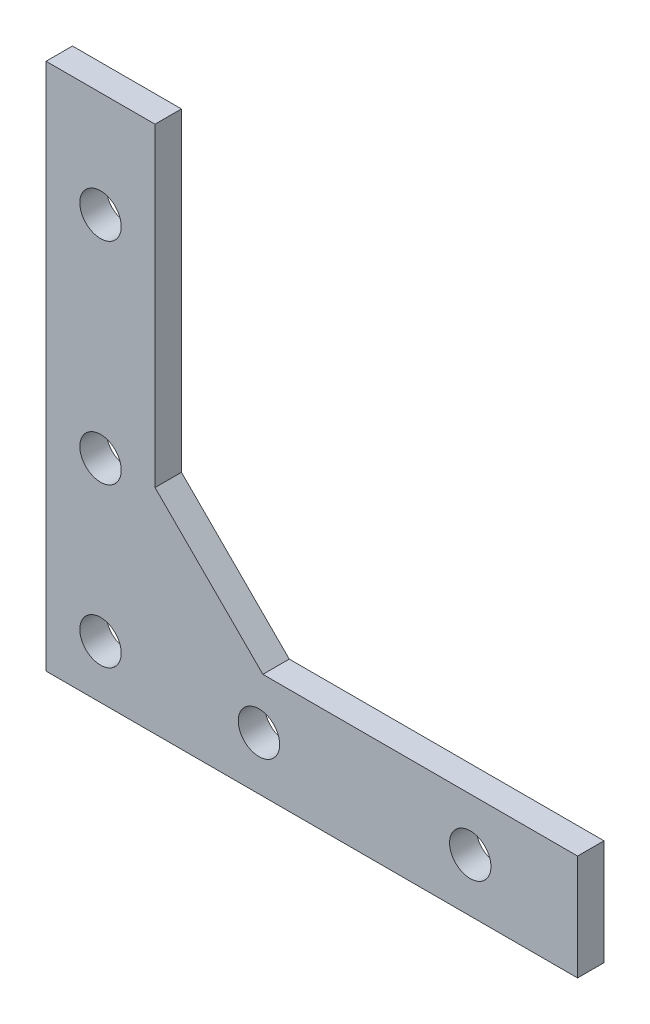
ISO-10303-21;
HEADER;
FILE_DESCRIPTION(('STEP AP214'),'2;1');
FILE_NAME('part.step','',(''),(''),'','','');
FILE_SCHEMA(('AUTOMOTIVE_DESIGN { 1 0 10303 214 1 1 1 1 }'));
ENDSEC;
DATA;
#1=APPLICATION_CONTEXT('core data for automotive mechanical design processes');
#2=APPLICATION_PROTOCOL_DEFINITION('international standard','automotive_design',2000,#1);
#3=PRODUCT_CONTEXT('',#1,'mechanical');
#4=PRODUCT('Part','Part','',(#3));
#5=PRODUCT_RELATED_PRODUCT_CATEGORY('part','',(#4));
#6=PRODUCT_DEFINITION_FORMATION('','',#4);
#7=PRODUCT_DEFINITION_CONTEXT('part definition',#1,'design');
#8=PRODUCT_DEFINITION('design','',#6,#7);
#9=PRODUCT_DEFINITION_SHAPE('','',#8);
#10=(LENGTH_UNIT() NAMED_UNIT(*) SI_UNIT(.MILLI.,.METRE.));
#11=(NAMED_UNIT(*) PLANE_ANGLE_UNIT() SI_UNIT($,.RADIAN.));
#12=(NAMED_UNIT(*) SI_UNIT($,.STERADIAN.) SOLID_ANGLE_UNIT());
#13=UNCERTAINTY_MEASURE_WITH_UNIT(LENGTH_MEASURE(1.E-05),#10,'distance_accuracy_value','');
#14=(GEOMETRIC_REPRESENTATION_CONTEXT(3) GLOBAL_UNCERTAINTY_ASSIGNED_CONTEXT((#13)) GLOBAL_UNIT_ASSIGNED_CONTEXT((#10,
#11,#12)) REPRESENTATION_CONTEXT('',''));
#15=CARTESIAN_POINT('',(0.,0.,0.));
#16=DIRECTION('',(0.,0.,1.));
#17=DIRECTION('',(1.,0.,0.));
#18=AXIS2_PLACEMENT_3D('',#15,#16,#17);
#19=CARTESIAN_POINT('',(-203.200000508,0.,3.175));
#20=DIRECTION('',(-1.,0.,0.));
#21=DIRECTION('',(0.,0.,1.));
#22=AXIS2_PLACEMENT_3D('',#19,#20,#21);
#23=PLANE('',#22);
#24=DIRECTION('',(0.,1.,0.));
#25=VECTOR('',#24,1.);
#26=CARTESIAN_POINT('',(-203.200000508,0.,0.));
#27=LINE('',#26,#25);
#28=CARTESIAN_POINT('',(-203.200000508,0.,0.));
#29=VERTEX_POINT('',#28);
#30=CARTESIAN_POINT('',(-203.200000508,12.7,0.));
#31=VERTEX_POINT('',#30);
#32=EDGE_CURVE('E131',#29,#31,#27,.T.);
#33=ORIENTED_EDGE('',*,*,#32,.T.);
#34=DIRECTION('',(0.,0.,-1.));
#35=VECTOR('',#34,1.);
#36=CARTESIAN_POINT('',(-203.200000508,12.7,3.175));
#37=LINE('',#36,#35);
#38=CARTESIAN_POINT('',(-203.200000508,12.7,3.175));
#39=VERTEX_POINT('',#38);
#40=EDGE_CURVE('E45',#39,#31,#37,.T.);
#41=ORIENTED_EDGE('',*,*,#40,.F.);
#42=DIRECTION('',(0.,1.,0.));
#43=VECTOR('',#42,1.);
#44=CARTESIAN_POINT('',(-203.200000508,0.,3.175));
#45=LINE('',#44,#43);
#46=CARTESIAN_POINT('',(-203.200000508,0.,3.175));
#47=VERTEX_POINT('',#46);
#48=EDGE_CURVE('E94',#47,#39,#45,.T.);
#49=ORIENTED_EDGE('',*,*,#48,.F.);
#50=DIRECTION('',(0.,0.,-1.));
#51=VECTOR('',#50,1.);
#52=CARTESIAN_POINT('',(-203.200000508,0.,3.175));
#53=LINE('',#52,#51);
#54=EDGE_CURVE('E11',#47,#29,#53,.T.);
#55=ORIENTED_EDGE('',*,*,#54,.T.);
#56=EDGE_LOOP('',(#33,#41,#49,#55));
#57=FACE_BOUND('',#56,.T.);
#58=ADVANCED_FACE('F37',(#57),#23,.F.);
#59=CARTESIAN_POINT('',(-203.200000508,12.7,3.175));
#60=DIRECTION('',(0.,-1.,0.));
#61=DIRECTION('',(0.,0.,-1.));
#62=AXIS2_PLACEMENT_3D('',#59,#60,#61);
#63=PLANE('',#62);
#64=DIRECTION('',(-1.,0.,0.));
#65=VECTOR('',#64,1.);
#66=CARTESIAN_POINT('',(-203.200000508,12.7,0.));
#67=LINE('',#66,#65);
#68=CARTESIAN_POINT('',(-241.033957433629,12.7,0.));
#69=VERTEX_POINT('',#68);
#70=EDGE_CURVE('E133',#31,#69,#67,.T.);
#71=ORIENTED_EDGE('',*,*,#70,.T.);
#72=DIRECTION('',(0.,0.,-1.));
#73=VECTOR('',#72,1.);
#74=CARTESIAN_POINT('',(-241.033957433629,12.7,3.175));
#75=LINE('',#74,#73);
#76=CARTESIAN_POINT('',(-241.033957433629,12.7,3.175));
#77=VERTEX_POINT('',#76);
#78=EDGE_CURVE('E146',#77,#69,#75,.T.);
#79=ORIENTED_EDGE('',*,*,#78,.F.);
#80=DIRECTION('',(-1.,0.,0.));
#81=VECTOR('',#80,1.);
#82=CARTESIAN_POINT('',(-203.200000508,12.7,3.175));
#83=LINE('',#82,#81);
#84=EDGE_CURVE('E154',#39,#77,#83,.T.);
#85=ORIENTED_EDGE('',*,*,#84,.F.);
#86=ORIENTED_EDGE('',*,*,#40,.T.);
#87=EDGE_LOOP('',(#71,#79,#85,#86));
#88=FACE_BOUND('',#87,.T.);
#89=ADVANCED_FACE('F152',(#88),#63,.F.);
#90=CARTESIAN_POINT('',(-241.033957433629,12.7,3.175));
#91=DIRECTION('',(-0.707106781186539,-0.707106781186556,0.));
#92=DIRECTION('',(0.707106781186556,-0.707106781186539,0.));
#93=AXIS2_PLACEMENT_3D('',#90,#91,#92);
#94=PLANE('',#93);
#95=DIRECTION('',(-0.707106781186556,0.707106781186539,0.));
#96=VECTOR('',#95,1.);
#97=CARTESIAN_POINT('',(-241.033957433629,12.7,0.));
#98=LINE('',#97,#96);
#99=CARTESIAN_POINT('',(-254.000000508,25.6660430743707,0.));
#100=VERTEX_POINT('',#99);
#101=EDGE_CURVE('E136',#69,#100,#98,.T.);
#102=ORIENTED_EDGE('',*,*,#101,.T.);
#103=DIRECTION('',(0.,0.,-1.));
#104=VECTOR('',#103,1.);
#105=CARTESIAN_POINT('',(-254.000000508,25.6660430743707,3.175));
#106=LINE('',#105,#104);
#107=CARTESIAN_POINT('',(-254.000000508,25.6660430743707,3.175));
#108=VERTEX_POINT('',#107);
#109=EDGE_CURVE('E120',#108,#100,#106,.T.);
#110=ORIENTED_EDGE('',*,*,#109,.F.);
#111=DIRECTION('',(-0.707106781186556,0.707106781186539,0.));
#112=VECTOR('',#111,1.);
#113=CARTESIAN_POINT('',(-241.033957433629,12.7,3.175));
#114=LINE('',#113,#112);
#115=EDGE_CURVE('E111',#77,#108,#114,.T.);
#116=ORIENTED_EDGE('',*,*,#115,.F.);
#117=ORIENTED_EDGE('',*,*,#78,.T.);
#118=EDGE_LOOP('',(#102,#110,#116,#117));
#119=FACE_BOUND('',#118,.T.);
#120=ADVANCED_FACE('F161',(#119),#94,.F.);
#121=CARTESIAN_POINT('',(-254.000000508,25.6660430743707,3.175));
#122=DIRECTION('',(-1.,0.,0.));
#123=DIRECTION('',(0.,0.,1.));
#124=AXIS2_PLACEMENT_3D('',#121,#122,#123);
#125=PLANE('',#124);
#126=DIRECTION('',(0.,1.,0.));
#127=VECTOR('',#126,1.);
#128=CARTESIAN_POINT('',(-254.000000508,25.6660430743707,0.));
#129=LINE('',#128,#127);
#130=CARTESIAN_POINT('',(-254.000000508,63.5,0.));
#131=VERTEX_POINT('',#130);
#132=EDGE_CURVE('E119',#100,#131,#129,.T.);
#133=ORIENTED_EDGE('',*,*,#132,.T.);
#134=DIRECTION('',(0.,0.,-1.));
#135=VECTOR('',#134,1.);
#136=CARTESIAN_POINT('',(-254.000000508,63.5,3.175));
#137=LINE('',#136,#135);
#138=CARTESIAN_POINT('',(-254.000000508,63.5,3.175));
#139=VERTEX_POINT('',#138);
#140=EDGE_CURVE('E116',#139,#131,#137,.T.);
#141=ORIENTED_EDGE('',*,*,#140,.F.);
#142=DIRECTION('',(0.,1.,0.));
#143=VECTOR('',#142,1.);
#144=CARTESIAN_POINT('',(-254.000000508,25.6660430743707,3.175));
#145=LINE('',#144,#143);
#146=EDGE_CURVE('E105',#108,#139,#145,.T.);
#147=ORIENTED_EDGE('',*,*,#146,.F.);
#148=ORIENTED_EDGE('',*,*,#109,.T.);
#149=EDGE_LOOP('',(#133,#141,#147,#148));
#150=FACE_BOUND('',#149,.T.);
#151=ADVANCED_FACE('F117',(#150),#125,.F.);
#152=CARTESIAN_POINT('',(-267.103367516007,63.5,3.175));
#153=DIRECTION('',(0.,-1.,0.));
#154=DIRECTION('',(0.,0.,-1.));
#155=AXIS2_PLACEMENT_3D('',#152,#153,#154);
#156=PLANE('',#155);
#157=DIRECTION('',(-1.,0.,0.));
#158=VECTOR('',#157,1.);
#159=CARTESIAN_POINT('',(-267.103367516007,63.5,0.));
#160=LINE('',#159,#158);
#161=CARTESIAN_POINT('',(-267.103367516007,63.5,0.));
#162=VERTEX_POINT('',#161);
#163=EDGE_CURVE('E80',#131,#162,#160,.T.);
#164=ORIENTED_EDGE('',*,*,#163,.T.);
#165=DIRECTION('',(0.,0.,-1.));
#166=VECTOR('',#165,1.);
#167=CARTESIAN_POINT('',(-267.103367516007,63.5,3.175));
#168=LINE('',#167,#166);
#169=CARTESIAN_POINT('',(-267.103367516007,63.5,3.175));
#170=VERTEX_POINT('',#169);
#171=EDGE_CURVE('E121',#170,#162,#168,.T.);
#172=ORIENTED_EDGE('',*,*,#171,.F.);
#173=DIRECTION('',(-1.,0.,0.));
#174=VECTOR('',#173,1.);
#175=CARTESIAN_POINT('',(-267.103367516007,63.5,3.175));
#176=LINE('',#175,#174);
#177=EDGE_CURVE('E109',#139,#170,#176,.T.);
#178=ORIENTED_EDGE('',*,*,#177,.F.);
#179=ORIENTED_EDGE('',*,*,#140,.T.);
#180=EDGE_LOOP('',(#164,#172,#178,#179));
#181=FACE_BOUND('',#180,.T.);
#182=ADVANCED_FACE('F123',(#181),#156,.F.);
#183=CARTESIAN_POINT('',(-267.103367516007,0.,3.175));
#184=DIRECTION('',(1.,0.,0.));
#185=DIRECTION('',(0.,0.,-1.));
#186=AXIS2_PLACEMENT_3D('',#183,#184,#185);
#187=PLANE('',#186);
#188=DIRECTION('',(0.,-1.,0.));
#189=VECTOR('',#188,1.);
#190=CARTESIAN_POINT('',(-267.103367516007,0.,0.));
#191=LINE('',#190,#189);
#192=CARTESIAN_POINT('',(-267.103367516007,0.,0.));
#193=VERTEX_POINT('',#192);
#194=EDGE_CURVE('E87',#162,#193,#191,.T.);
#195=ORIENTED_EDGE('',*,*,#194,.T.);
#196=DIRECTION('',(0.,0.,-1.));
#197=VECTOR('',#196,1.);
#198=CARTESIAN_POINT('',(-267.103367516007,0.,3.175));
#199=LINE('',#198,#197);
#200=CARTESIAN_POINT('',(-267.103367516007,0.,3.175));
#201=VERTEX_POINT('',#200);
#202=EDGE_CURVE('E127',#201,#193,#199,.T.);
#203=ORIENTED_EDGE('',*,*,#202,.F.);
#204=DIRECTION('',(0.,-1.,0.));
#205=VECTOR('',#204,1.);
#206=CARTESIAN_POINT('',(-267.103367516007,0.,3.175));
#207=LINE('',#206,#205);
#208=EDGE_CURVE('E125',#170,#201,#207,.T.);
#209=ORIENTED_EDGE('',*,*,#208,.F.);
#210=ORIENTED_EDGE('',*,*,#171,.T.);
#211=EDGE_LOOP('',(#195,#203,#209,#210));
#212=FACE_BOUND('',#211,.T.);
#213=ADVANCED_FACE('F229',(#212),#187,.F.);
#214=CARTESIAN_POINT('',(-254.000000508,0.,3.175));
#215=DIRECTION('',(0.,1.,0.));
#216=DIRECTION('',(-1.,0.,0.));
#217=AXIS2_PLACEMENT_3D('',#214,#215,#216);
#218=PLANE('',#217);
#219=DIRECTION('',(1.,0.,0.));
#220=VECTOR('',#219,1.);
#221=CARTESIAN_POINT('',(-254.000000508,0.,0.));
#222=LINE('',#221,#220);
#223=EDGE_CURVE('E141',#193,#29,#222,.T.);
#224=ORIENTED_EDGE('',*,*,#223,.T.);
#225=ORIENTED_EDGE('',*,*,#54,.F.);
#226=DIRECTION('',(1.,0.,0.));
#227=VECTOR('',#226,1.);
#228=CARTESIAN_POINT('',(-254.000000508,0.,3.175));
#229=LINE('',#228,#227);
#230=EDGE_CURVE('E53',#201,#47,#229,.T.);
#231=ORIENTED_EDGE('',*,*,#230,.F.);
#232=ORIENTED_EDGE('',*,*,#202,.T.);
#233=EDGE_LOOP('',(#224,#225,#231,#232));
#234=FACE_BOUND('',#233,.T.);
#235=ADVANCED_FACE('F200',(#234),#218,.F.);
#236=CARTESIAN_POINT('',(0.,0.,3.175));
#237=DIRECTION('',(0.,0.,1.));
#238=DIRECTION('',(1.,0.,0.));
#239=AXIS2_PLACEMENT_3D('',#236,#237,#238);
#240=PLANE('',#239);
#241=CARTESIAN_POINT('',(-260.551684012004,6.38822941469469,3.175));
#242=DIRECTION('',(0.,0.,1.));
#243=DIRECTION('',(1.,0.,0.));
#244=AXIS2_PLACEMENT_3D('',#241,#242,#243);
#245=CIRCLE('',#244,2.48919999999997);
#246=CARTESIAN_POINT('',(-258.062484012004,6.38822941469469,3.175));
#247=VERTEX_POINT('',#246);
#248=EDGE_CURVE('E192',#247,#247,#245,.T.);
#249=ORIENTED_EDGE('',*,*,#248,.F.);
#250=EDGE_LOOP('',(#249));
#251=FACE_BOUND('',#250,.T.);
#252=CARTESIAN_POINT('',(-260.551684012004,25.4382294146947,3.175));
#253=DIRECTION('',(0.,0.,1.));
#254=DIRECTION('',(1.,0.,0.));
#255=AXIS2_PLACEMENT_3D('',#252,#253,#254);
#256=CIRCLE('',#255,2.48919999999997);
#257=CARTESIAN_POINT('',(-258.062484012004,25.4382294146947,3.175));
#258=VERTEX_POINT('',#257);
#259=EDGE_CURVE('E186',#258,#258,#256,.T.);
#260=ORIENTED_EDGE('',*,*,#259,.F.);
#261=EDGE_LOOP('',(#260));
#262=FACE_BOUND('',#261,.T.);
#263=CARTESIAN_POINT('',(-260.551684012004,50.8,3.175));
#264=DIRECTION('',(0.,0.,1.));
#265=DIRECTION('',(1.,0.,0.));
#266=AXIS2_PLACEMENT_3D('',#263,#264,#265);
#267=CIRCLE('',#266,2.48919999999997);
#268=CARTESIAN_POINT('',(-258.062484012004,50.8,3.175));
#269=VERTEX_POINT('',#268);
#270=EDGE_CURVE('E180',#269,#269,#267,.T.);
#271=ORIENTED_EDGE('',*,*,#270,.F.);
#272=EDGE_LOOP('',(#271));
#273=FACE_BOUND('',#272,.T.);
#274=CARTESIAN_POINT('',(-241.501684012004,6.38822941469469,3.175));
#275=DIRECTION('',(0.,0.,1.));
#276=DIRECTION('',(1.,0.,0.));
#277=AXIS2_PLACEMENT_3D('',#274,#275,#276);
#278=CIRCLE('',#277,2.4892);
#279=CARTESIAN_POINT('',(-239.012484012004,6.38822941469469,3.175));
#280=VERTEX_POINT('',#279);
#281=EDGE_CURVE('E174',#280,#280,#278,.T.);
#282=ORIENTED_EDGE('',*,*,#281,.F.);
#283=EDGE_LOOP('',(#282));
#284=FACE_BOUND('',#283,.T.);
#285=CARTESIAN_POINT('',(-216.101684012004,6.38822941469469,3.175));
#286=DIRECTION('',(0.,0.,1.));
#287=DIRECTION('',(1.,0.,0.));
#288=AXIS2_PLACEMENT_3D('',#285,#286,#287);
#289=CIRCLE('',#288,2.4892);
#290=CARTESIAN_POINT('',(-213.612484012004,6.38822941469469,3.175));
#291=VERTEX_POINT('',#290);
#292=EDGE_CURVE('E168',#291,#291,#289,.T.);
#293=ORIENTED_EDGE('',*,*,#292,.F.);
#294=EDGE_LOOP('',(#293));
#295=FACE_BOUND('',#294,.T.);
#296=ORIENTED_EDGE('',*,*,#230,.T.);
#297=ORIENTED_EDGE('',*,*,#48,.T.);
#298=ORIENTED_EDGE('',*,*,#84,.T.);
#299=ORIENTED_EDGE('',*,*,#115,.T.);
#300=ORIENTED_EDGE('',*,*,#146,.T.);
#301=ORIENTED_EDGE('',*,*,#177,.T.);
#302=ORIENTED_EDGE('',*,*,#208,.T.);
#303=EDGE_LOOP('',(#296,#297,#298,#299,#300,#301,#302));
#304=FACE_BOUND('',#303,.T.);
#305=ADVANCED_FACE('F107',(#251,#262,#273,#284,#295,#304),#240,.T.);
#306=CARTESIAN_POINT('',(0.,0.,0.));
#307=DIRECTION('',(0.,0.,1.));
#308=DIRECTION('',(1.,0.,0.));
#309=AXIS2_PLACEMENT_3D('',#306,#307,#308);
#310=PLANE('',#309);
#311=CARTESIAN_POINT('',(-260.551684012004,6.38822941469469,0.));
#312=DIRECTION('',(0.,0.,1.));
#313=DIRECTION('',(1.,0.,0.));
#314=AXIS2_PLACEMENT_3D('',#311,#312,#313);
#315=CIRCLE('',#314,2.48920000000002);
#316=CARTESIAN_POINT('',(-258.062484012004,6.38822941469469,0.));
#317=VERTEX_POINT('',#316);
#318=EDGE_CURVE('E189',#317,#317,#315,.T.);
#319=ORIENTED_EDGE('',*,*,#318,.T.);
#320=EDGE_LOOP('',(#319));
#321=FACE_BOUND('',#320,.T.);
#322=CARTESIAN_POINT('',(-260.551684012004,25.4382294146947,0.));
#323=DIRECTION('',(0.,0.,1.));
#324=DIRECTION('',(1.,0.,0.));
#325=AXIS2_PLACEMENT_3D('',#322,#323,#324);
#326=CIRCLE('',#325,2.48920000000002);
#327=CARTESIAN_POINT('',(-258.062484012004,25.4382294146947,0.));
#328=VERTEX_POINT('',#327);
#329=EDGE_CURVE('E183',#328,#328,#326,.T.);
#330=ORIENTED_EDGE('',*,*,#329,.T.);
#331=EDGE_LOOP('',(#330));
#332=FACE_BOUND('',#331,.T.);
#333=CARTESIAN_POINT('',(-260.551684012004,50.8,0.));
#334=DIRECTION('',(0.,0.,1.));
#335=DIRECTION('',(1.,0.,0.));
#336=AXIS2_PLACEMENT_3D('',#333,#334,#335);
#337=CIRCLE('',#336,2.48920000000002);
#338=CARTESIAN_POINT('',(-258.062484012004,50.8,0.));
#339=VERTEX_POINT('',#338);
#340=EDGE_CURVE('E177',#339,#339,#337,.T.);
#341=ORIENTED_EDGE('',*,*,#340,.T.);
#342=EDGE_LOOP('',(#341));
#343=FACE_BOUND('',#342,.T.);
#344=CARTESIAN_POINT('',(-241.501684012004,6.38822941469469,0.));
#345=DIRECTION('',(0.,0.,1.));
#346=DIRECTION('',(1.,0.,0.));
#347=AXIS2_PLACEMENT_3D('',#344,#345,#346);
#348=CIRCLE('',#347,2.4892);
#349=CARTESIAN_POINT('',(-239.012484012004,6.38822941469469,0.));
#350=VERTEX_POINT('',#349);
#351=EDGE_CURVE('E171',#350,#350,#348,.T.);
#352=ORIENTED_EDGE('',*,*,#351,.T.);
#353=EDGE_LOOP('',(#352));
#354=FACE_BOUND('',#353,.T.);
#355=CARTESIAN_POINT('',(-216.101684012004,6.38822941469469,0.));
#356=DIRECTION('',(0.,0.,1.));
#357=DIRECTION('',(1.,0.,0.));
#358=AXIS2_PLACEMENT_3D('',#355,#356,#357);
#359=CIRCLE('',#358,2.4892);
#360=CARTESIAN_POINT('',(-213.612484012004,6.38822941469469,0.));
#361=VERTEX_POINT('',#360);
#362=EDGE_CURVE('E134',#361,#361,#359,.T.);
#363=ORIENTED_EDGE('',*,*,#362,.T.);
#364=EDGE_LOOP('',(#363));
#365=FACE_BOUND('',#364,.T.);
#366=ORIENTED_EDGE('',*,*,#32,.F.);
#367=ORIENTED_EDGE('',*,*,#223,.F.);
#368=ORIENTED_EDGE('',*,*,#194,.F.);
#369=ORIENTED_EDGE('',*,*,#163,.F.);
#370=ORIENTED_EDGE('',*,*,#132,.F.);
#371=ORIENTED_EDGE('',*,*,#101,.F.);
#372=ORIENTED_EDGE('',*,*,#70,.F.);
#373=EDGE_LOOP('',(#366,#367,#368,#369,#370,#371,#372));
#374=FACE_BOUND('',#373,.T.);
#375=ADVANCED_FACE('F158',(#321,#332,#343,#354,#365,#374),#310,.F.);
#376=CARTESIAN_POINT('',(-216.101684012004,6.38822941469469,3.175));
#377=DIRECTION('',(0.,0.,1.));
#378=DIRECTION('',(1.,0.,0.));
#379=AXIS2_PLACEMENT_3D('',#376,#377,#378);
#380=CYLINDRICAL_SURFACE('',#379,2.4892);
#381=ORIENTED_EDGE('',*,*,#362,.F.);
#382=EDGE_LOOP('',(#381));
#383=FACE_BOUND('',#382,.T.);
#384=ORIENTED_EDGE('',*,*,#292,.T.);
#385=EDGE_LOOP('',(#384));
#386=FACE_BOUND('',#385,.T.);
#387=ADVANCED_FACE('F210',(#383,#386),#380,.F.);
#388=CARTESIAN_POINT('',(-241.501684012004,6.38822941469469,3.175));
#389=DIRECTION('',(0.,0.,1.));
#390=DIRECTION('',(1.,0.,0.));
#391=AXIS2_PLACEMENT_3D('',#388,#389,#390);
#392=CYLINDRICAL_SURFACE('',#391,2.4892);
#393=ORIENTED_EDGE('',*,*,#351,.F.);
#394=EDGE_LOOP('',(#393));
#395=FACE_BOUND('',#394,.T.);
#396=ORIENTED_EDGE('',*,*,#281,.T.);
#397=EDGE_LOOP('',(#396));
#398=FACE_BOUND('',#397,.T.);
#399=ADVANCED_FACE('F212',(#395,#398),#392,.F.);
#400=CARTESIAN_POINT('',(-260.551684012004,50.8,3.175));
#401=DIRECTION('',(0.,0.,1.));
#402=DIRECTION('',(1.,0.,0.));
#403=AXIS2_PLACEMENT_3D('',#400,#401,#402);
#404=CYLINDRICAL_SURFACE('',#403,2.4892);
#405=ORIENTED_EDGE('',*,*,#340,.F.);
#406=EDGE_LOOP('',(#405));
#407=FACE_BOUND('',#406,.T.);
#408=ORIENTED_EDGE('',*,*,#270,.T.);
#409=EDGE_LOOP('',(#408));
#410=FACE_BOUND('',#409,.T.);
#411=ADVANCED_FACE('F219',(#407,#410),#404,.F.);
#412=CARTESIAN_POINT('',(-260.551684012004,25.4382294146947,3.175));
#413=DIRECTION('',(0.,0.,1.));
#414=DIRECTION('',(1.,0.,0.));
#415=AXIS2_PLACEMENT_3D('',#412,#413,#414);
#416=CYLINDRICAL_SURFACE('',#415,2.4892);
#417=ORIENTED_EDGE('',*,*,#329,.F.);
#418=EDGE_LOOP('',(#417));
#419=FACE_BOUND('',#418,.T.);
#420=ORIENTED_EDGE('',*,*,#259,.T.);
#421=EDGE_LOOP('',(#420));
#422=FACE_BOUND('',#421,.T.);
#423=ADVANCED_FACE('F302',(#419,#422),#416,.F.);
#424=CARTESIAN_POINT('',(-260.551684012004,6.38822941469469,3.175));
#425=DIRECTION('',(0.,0.,1.));
#426=DIRECTION('',(1.,0.,0.));
#427=AXIS2_PLACEMENT_3D('',#424,#425,#426);
#428=CYLINDRICAL_SURFACE('',#427,2.4892);
#429=ORIENTED_EDGE('',*,*,#318,.F.);
#430=EDGE_LOOP('',(#429));
#431=FACE_BOUND('',#430,.T.);
#432=ORIENTED_EDGE('',*,*,#248,.T.);
#433=EDGE_LOOP('',(#432));
#434=FACE_BOUND('',#433,.T.);
#435=ADVANCED_FACE('F196',(#431,#434),#428,.F.);
#436=CLOSED_SHELL('',(#58,#89,#120,#151,#182,#213,#235,#305,#375,#387,#399,#411,#423,#435));
#437=MANIFOLD_SOLID_BREP('B2',#436);
#438=ADVANCED_BREP_SHAPE_REPRESENTATION('',(#18,#437),#14);
#439=SHAPE_DEFINITION_REPRESENTATION(#9,#438);
ENDSEC;
END-ISO-10303-21;
